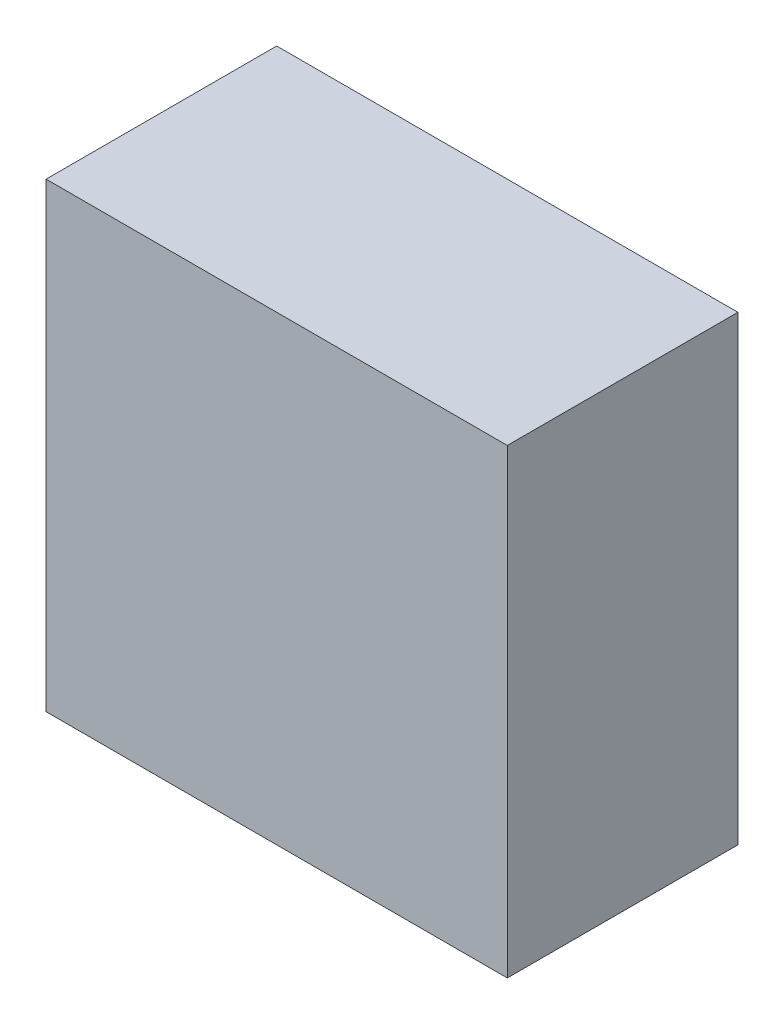
ISO-10303-21;
HEADER;
FILE_DESCRIPTION(('STEP AP214'),'2;1');
FILE_NAME('part.step','',(''),(''),'','','');
FILE_SCHEMA(('AUTOMOTIVE_DESIGN { 1 0 10303 214 1 1 1 1 }'));
ENDSEC;
DATA;
#1=APPLICATION_CONTEXT('core data for automotive mechanical design processes');
#2=APPLICATION_PROTOCOL_DEFINITION('international standard','automotive_design',2000,#1);
#3=PRODUCT_CONTEXT('',#1,'mechanical');
#4=PRODUCT('Part','Part','',(#3));
#5=PRODUCT_RELATED_PRODUCT_CATEGORY('part','',(#4));
#6=PRODUCT_DEFINITION_FORMATION('','',#4);
#7=PRODUCT_DEFINITION_CONTEXT('part definition',#1,'design');
#8=PRODUCT_DEFINITION('design','',#6,#7);
#9=PRODUCT_DEFINITION_SHAPE('','',#8);
#10=(LENGTH_UNIT() NAMED_UNIT(*) SI_UNIT(.MILLI.,.METRE.));
#11=(NAMED_UNIT(*) PLANE_ANGLE_UNIT() SI_UNIT($,.RADIAN.));
#12=(NAMED_UNIT(*) SI_UNIT($,.STERADIAN.) SOLID_ANGLE_UNIT());
#13=UNCERTAINTY_MEASURE_WITH_UNIT(LENGTH_MEASURE(1.E-05),#10,'distance_accuracy_value','');
#14=(GEOMETRIC_REPRESENTATION_CONTEXT(3) GLOBAL_UNCERTAINTY_ASSIGNED_CONTEXT((#13)) GLOBAL_UNIT_ASSIGNED_CONTEXT((#10,
#11,#12)) REPRESENTATION_CONTEXT('',''));
#15=CARTESIAN_POINT('',(0.,0.,0.));
#16=DIRECTION('',(0.,0.,1.));
#17=DIRECTION('',(1.,0.,0.));
#18=AXIS2_PLACEMENT_3D('',#15,#16,#17);
#19=CARTESIAN_POINT('',(0.,12.7,-6.35));
#20=DIRECTION('',(1.,0.,0.));
#21=DIRECTION('',(0.,0.,-1.));
#22=AXIS2_PLACEMENT_3D('',#19,#20,#21);
#23=PLANE('',#22);
#24=DIRECTION('',(0.,0.,1.));
#25=VECTOR('',#24,1.);
#26=CARTESIAN_POINT('',(0.,0.,-6.35));
#27=LINE('',#26,#25);
#28=CARTESIAN_POINT('',(0.,0.,-6.35));
#29=VERTEX_POINT('',#28);
#30=CARTESIAN_POINT('',(0.,0.,0.));
#31=VERTEX_POINT('',#30);
#32=EDGE_CURVE('E97',#29,#31,#27,.T.);
#33=ORIENTED_EDGE('',*,*,#32,.T.);
#34=DIRECTION('',(0.,-1.,0.));
#35=VECTOR('',#34,1.);
#36=CARTESIAN_POINT('',(0.,12.7,0.));
#37=LINE('',#36,#35);
#38=CARTESIAN_POINT('',(0.,12.7,0.));
#39=VERTEX_POINT('',#38);
#40=EDGE_CURVE('E11',#39,#31,#37,.T.);
#41=ORIENTED_EDGE('',*,*,#40,.F.);
#42=DIRECTION('',(0.,0.,1.));
#43=VECTOR('',#42,1.);
#44=CARTESIAN_POINT('',(0.,12.7,-6.35));
#45=LINE('',#44,#43);
#46=CARTESIAN_POINT('',(0.,12.7,-6.35));
#47=VERTEX_POINT('',#46);
#48=EDGE_CURVE('E85',#47,#39,#45,.T.);
#49=ORIENTED_EDGE('',*,*,#48,.F.);
#50=DIRECTION('',(0.,-1.,0.));
#51=VECTOR('',#50,1.);
#52=CARTESIAN_POINT('',(0.,12.7,-6.35));
#53=LINE('',#52,#51);
#54=EDGE_CURVE('E93',#47,#29,#53,.T.);
#55=ORIENTED_EDGE('',*,*,#54,.T.);
#56=EDGE_LOOP('',(#33,#41,#49,#55));
#57=FACE_BOUND('',#56,.T.);
#58=ADVANCED_FACE('F34',(#57),#23,.F.);
#59=CARTESIAN_POINT('',(0.,12.7,0.));
#60=DIRECTION('',(0.,0.,-1.));
#61=DIRECTION('',(-1.,0.,0.));
#62=AXIS2_PLACEMENT_3D('',#59,#60,#61);
#63=PLANE('',#62);
#64=DIRECTION('',(1.,0.,0.));
#65=VECTOR('',#64,1.);
#66=CARTESIAN_POINT('',(0.,0.,0.));
#67=LINE('',#66,#65);
#68=CARTESIAN_POINT('',(12.7,0.,0.));
#69=VERTEX_POINT('',#68);
#70=EDGE_CURVE('E89',#31,#69,#67,.T.);
#71=ORIENTED_EDGE('',*,*,#70,.T.);
#72=DIRECTION('',(0.,-1.,0.));
#73=VECTOR('',#72,1.);
#74=CARTESIAN_POINT('',(12.7,12.7,0.));
#75=LINE('',#74,#73);
#76=CARTESIAN_POINT('',(12.7,12.7,0.));
#77=VERTEX_POINT('',#76);
#78=EDGE_CURVE('E42',#77,#69,#75,.T.);
#79=ORIENTED_EDGE('',*,*,#78,.F.);
#80=DIRECTION('',(1.,0.,0.));
#81=VECTOR('',#80,1.);
#82=CARTESIAN_POINT('',(0.,12.7,0.));
#83=LINE('',#82,#81);
#84=EDGE_CURVE('E80',#39,#77,#83,.T.);
#85=ORIENTED_EDGE('',*,*,#84,.F.);
#86=ORIENTED_EDGE('',*,*,#40,.T.);
#87=EDGE_LOOP('',(#71,#79,#85,#86));
#88=FACE_BOUND('',#87,.T.);
#89=ADVANCED_FACE('F88',(#88),#63,.F.);
#90=CARTESIAN_POINT('',(12.7,12.7,0.));
#91=DIRECTION('',(-1.,0.,0.));
#92=DIRECTION('',(0.,0.,1.));
#93=AXIS2_PLACEMENT_3D('',#90,#91,#92);
#94=PLANE('',#93);
#95=DIRECTION('',(0.,0.,-1.));
#96=VECTOR('',#95,1.);
#97=CARTESIAN_POINT('',(12.7,0.,0.));
#98=LINE('',#97,#96);
#99=CARTESIAN_POINT('',(12.7,0.,-6.35));
#100=VERTEX_POINT('',#99);
#101=EDGE_CURVE('E67',#69,#100,#98,.T.);
#102=ORIENTED_EDGE('',*,*,#101,.T.);
#103=DIRECTION('',(0.,-1.,0.));
#104=VECTOR('',#103,1.);
#105=CARTESIAN_POINT('',(12.7,12.7,-6.35));
#106=LINE('',#105,#104);
#107=CARTESIAN_POINT('',(12.7,12.7,-6.35));
#108=VERTEX_POINT('',#107);
#109=EDGE_CURVE('E90',#108,#100,#106,.T.);
#110=ORIENTED_EDGE('',*,*,#109,.F.);
#111=DIRECTION('',(0.,0.,-1.));
#112=VECTOR('',#111,1.);
#113=CARTESIAN_POINT('',(12.7,12.7,0.));
#114=LINE('',#113,#112);
#115=EDGE_CURVE('E83',#77,#108,#114,.T.);
#116=ORIENTED_EDGE('',*,*,#115,.F.);
#117=ORIENTED_EDGE('',*,*,#78,.T.);
#118=EDGE_LOOP('',(#102,#110,#116,#117));
#119=FACE_BOUND('',#118,.T.);
#120=ADVANCED_FACE('F91',(#119),#94,.F.);
#121=CARTESIAN_POINT('',(12.7,12.7,-6.35));
#122=DIRECTION('',(0.,0.,1.));
#123=DIRECTION('',(1.,0.,0.));
#124=AXIS2_PLACEMENT_3D('',#121,#122,#123);
#125=PLANE('',#124);
#126=DIRECTION('',(-1.,0.,0.));
#127=VECTOR('',#126,1.);
#128=CARTESIAN_POINT('',(12.7,0.,-6.35));
#129=LINE('',#128,#127);
#130=EDGE_CURVE('E73',#100,#29,#129,.T.);
#131=ORIENTED_EDGE('',*,*,#130,.T.);
#132=ORIENTED_EDGE('',*,*,#54,.F.);
#133=DIRECTION('',(-1.,0.,0.));
#134=VECTOR('',#133,1.);
#135=CARTESIAN_POINT('',(12.7,12.7,-6.35));
#136=LINE('',#135,#134);
#137=EDGE_CURVE('E50',#108,#47,#136,.T.);
#138=ORIENTED_EDGE('',*,*,#137,.F.);
#139=ORIENTED_EDGE('',*,*,#109,.T.);
#140=EDGE_LOOP('',(#131,#132,#138,#139));
#141=FACE_BOUND('',#140,.T.);
#142=ADVANCED_FACE('F104',(#141),#125,.F.);
#143=CARTESIAN_POINT('',(0.,12.7,0.));
#144=DIRECTION('',(0.,1.,0.));
#145=DIRECTION('',(0.,0.,1.));
#146=AXIS2_PLACEMENT_3D('',#143,#144,#145);
#147=PLANE('',#146);
#148=ORIENTED_EDGE('',*,*,#48,.T.);
#149=ORIENTED_EDGE('',*,*,#84,.T.);
#150=ORIENTED_EDGE('',*,*,#115,.T.);
#151=ORIENTED_EDGE('',*,*,#137,.T.);
#152=EDGE_LOOP('',(#148,#149,#150,#151));
#153=FACE_BOUND('',#152,.T.);
#154=ADVANCED_FACE('F81',(#153),#147,.T.);
#155=CARTESIAN_POINT('',(0.,0.,0.));
#156=DIRECTION('',(0.,1.,0.));
#157=DIRECTION('',(0.,0.,1.));
#158=AXIS2_PLACEMENT_3D('',#155,#156,#157);
#159=PLANE('',#158);
#160=ORIENTED_EDGE('',*,*,#32,.F.);
#161=ORIENTED_EDGE('',*,*,#130,.F.);
#162=ORIENTED_EDGE('',*,*,#101,.F.);
#163=ORIENTED_EDGE('',*,*,#70,.F.);
#164=EDGE_LOOP('',(#160,#161,#162,#163));
#165=FACE_BOUND('',#164,.T.);
#166=ADVANCED_FACE('F107',(#165),#159,.F.);
#167=CLOSED_SHELL('',(#58,#89,#120,#142,#154,#166));
#168=MANIFOLD_SOLID_BREP('B2',#167);
#169=ADVANCED_BREP_SHAPE_REPRESENTATION('',(#18,#168),#14);
#170=SHAPE_DEFINITION_REPRESENTATION(#9,#169);
ENDSEC;
END-ISO-10303-21;
